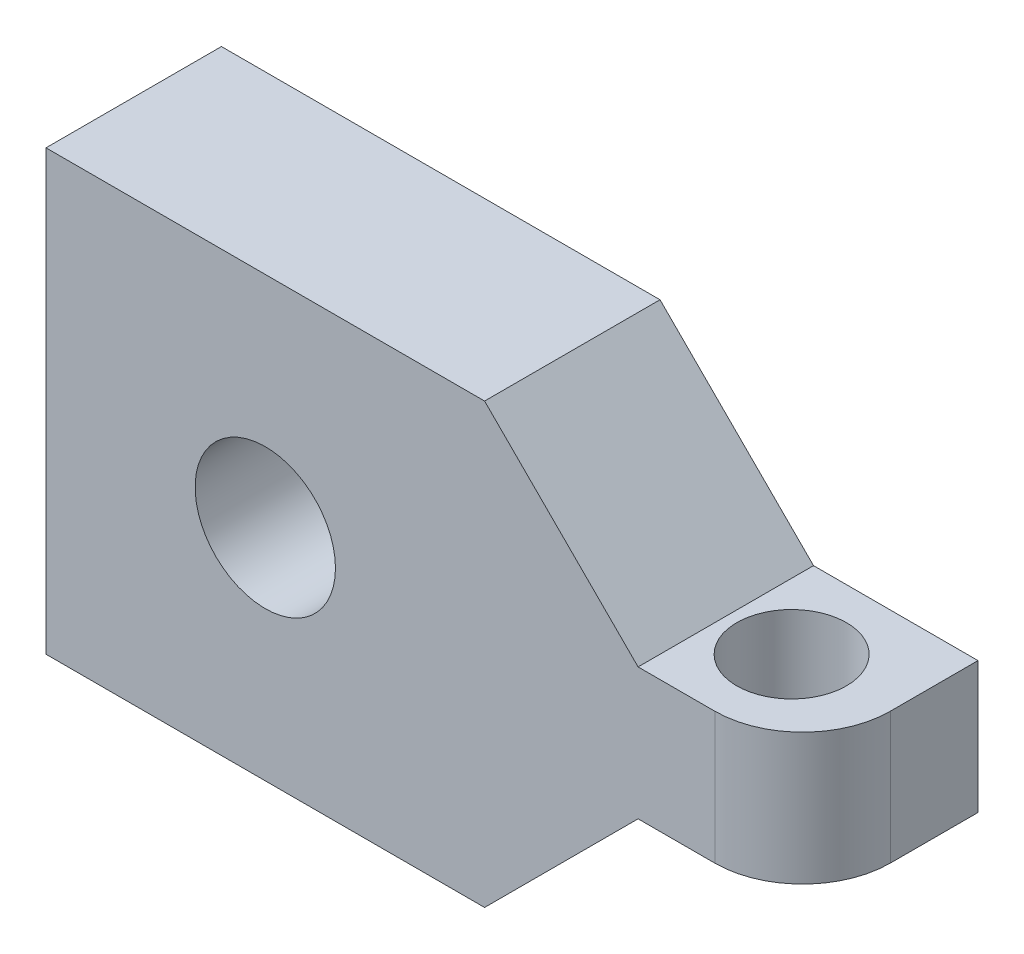
ISO-10303-21;
HEADER;
FILE_DESCRIPTION(('STEP AP214'),'2;1');
FILE_NAME('part.step','',(''),(''),'','','');
FILE_SCHEMA(('AUTOMOTIVE_DESIGN { 1 0 10303 214 1 1 1 1 }'));
ENDSEC;
DATA;
#1=APPLICATION_CONTEXT('core data for automotive mechanical design processes');
#2=APPLICATION_PROTOCOL_DEFINITION('international standard','automotive_design',2000,#1);
#3=PRODUCT_CONTEXT('',#1,'mechanical');
#4=PRODUCT('Part','Part','',(#3));
#5=PRODUCT_RELATED_PRODUCT_CATEGORY('part','',(#4));
#6=PRODUCT_DEFINITION_FORMATION('','',#4);
#7=PRODUCT_DEFINITION_CONTEXT('part definition',#1,'design');
#8=PRODUCT_DEFINITION('design','',#6,#7);
#9=PRODUCT_DEFINITION_SHAPE('','',#8);
#10=(LENGTH_UNIT() NAMED_UNIT(*) SI_UNIT(.MILLI.,.METRE.));
#11=(NAMED_UNIT(*) PLANE_ANGLE_UNIT() SI_UNIT($,.RADIAN.));
#12=(NAMED_UNIT(*) SI_UNIT($,.STERADIAN.) SOLID_ANGLE_UNIT());
#13=UNCERTAINTY_MEASURE_WITH_UNIT(LENGTH_MEASURE(1.E-05),#10,'distance_accuracy_value','');
#14=(GEOMETRIC_REPRESENTATION_CONTEXT(3) GLOBAL_UNCERTAINTY_ASSIGNED_CONTEXT((#13)) GLOBAL_UNIT_ASSIGNED_CONTEXT((#10,
#11,#12)) REPRESENTATION_CONTEXT('',''));
#15=CARTESIAN_POINT('',(0.,0.,0.));
#16=DIRECTION('',(0.,0.,1.));
#17=DIRECTION('',(1.,0.,0.));
#18=AXIS2_PLACEMENT_3D('',#15,#16,#17);
#19=CARTESIAN_POINT('',(-10.,5.,4.));
#20=DIRECTION('',(0.,-1.,0.));
#21=DIRECTION('',(1.,0.,0.));
#22=AXIS2_PLACEMENT_3D('',#19,#20,#21);
#23=PLANE('',#22);
#24=DIRECTION('',(0.,0.,1.));
#25=VECTOR('',#24,1.);
#26=CARTESIAN_POINT('',(0.,5.,0.));
#27=LINE('',#26,#25);
#28=CARTESIAN_POINT('',(0.,5.,0.));
#29=VERTEX_POINT('',#28);
#30=CARTESIAN_POINT('',(0.,5.,4.));
#31=VERTEX_POINT('',#30);
#32=EDGE_CURVE('E139',#29,#31,#27,.T.);
#33=ORIENTED_EDGE('',*,*,#32,.F.);
#34=DIRECTION('',(-1.,0.,0.));
#35=VECTOR('',#34,1.);
#36=CARTESIAN_POINT('',(-10.,5.,0.));
#37=LINE('',#36,#35);
#38=CARTESIAN_POINT('',(-10.,5.,0.));
#39=VERTEX_POINT('',#38);
#40=EDGE_CURVE('E156',#29,#39,#37,.T.);
#41=ORIENTED_EDGE('',*,*,#40,.T.);
#42=DIRECTION('',(0.,0.,-1.));
#43=VECTOR('',#42,1.);
#44=CARTESIAN_POINT('',(-10.,5.,4.));
#45=LINE('',#44,#43);
#46=CARTESIAN_POINT('',(-10.,5.,4.));
#47=VERTEX_POINT('',#46);
#48=EDGE_CURVE('E173',#47,#39,#45,.T.);
#49=ORIENTED_EDGE('',*,*,#48,.F.);
#50=DIRECTION('',(-1.,0.,0.));
#51=VECTOR('',#50,1.);
#52=CARTESIAN_POINT('',(-10.,5.,4.));
#53=LINE('',#52,#51);
#54=EDGE_CURVE('E158',#31,#47,#53,.T.);
#55=ORIENTED_EDGE('',*,*,#54,.F.);
#56=EDGE_LOOP('',(#33,#41,#49,#55));
#57=FACE_BOUND('',#56,.T.);
#58=ADVANCED_FACE('F44',(#57),#23,.F.);
#59=CARTESIAN_POINT('',(7.25,-5.,0.));
#60=DIRECTION('',(-1.,0.,0.));
#61=DIRECTION('',(0.,0.,1.));
#62=AXIS2_PLACEMENT_3D('',#59,#60,#61);
#63=PLANE('',#62);
#64=DIRECTION('',(0.,0.,1.));
#65=VECTOR('',#64,1.);
#66=CARTESIAN_POINT('',(7.25,1.5,0.));
#67=LINE('',#66,#65);
#68=CARTESIAN_POINT('',(7.25,1.5,0.));
#69=VERTEX_POINT('',#68);
#70=CARTESIAN_POINT('',(7.25,1.5,2.));
#71=VERTEX_POINT('',#70);
#72=EDGE_CURVE('E130',#69,#71,#67,.T.);
#73=ORIENTED_EDGE('',*,*,#72,.T.);
#74=DIRECTION('',(0.,-1.,0.));
#75=VECTOR('',#74,1.);
#76=CARTESIAN_POINT('',(7.25,-1.5,2.));
#77=LINE('',#76,#75);
#78=CARTESIAN_POINT('',(7.25,-1.5,2.));
#79=VERTEX_POINT('',#78);
#80=EDGE_CURVE('E192',#71,#79,#77,.T.);
#81=ORIENTED_EDGE('',*,*,#80,.T.);
#82=DIRECTION('',(0.,0.,1.));
#83=VECTOR('',#82,1.);
#84=CARTESIAN_POINT('',(7.25,-1.5,0.));
#85=LINE('',#84,#83);
#86=CARTESIAN_POINT('',(7.25,-1.5,0.));
#87=VERTEX_POINT('',#86);
#88=EDGE_CURVE('E143',#87,#79,#85,.T.);
#89=ORIENTED_EDGE('',*,*,#88,.F.);
#90=DIRECTION('',(0.,-1.,0.));
#91=VECTOR('',#90,1.);
#92=CARTESIAN_POINT('',(7.25,-5.,0.));
#93=LINE('',#92,#91);
#94=EDGE_CURVE('E122',#69,#87,#93,.T.);
#95=ORIENTED_EDGE('',*,*,#94,.F.);
#96=EDGE_LOOP('',(#73,#81,#89,#95));
#97=FACE_BOUND('',#96,.T.);
#98=ADVANCED_FACE('F138',(#97),#63,.F.);
#99=CARTESIAN_POINT('',(-10.,-5.,4.));
#100=DIRECTION('',(1.,0.,0.));
#101=DIRECTION('',(0.,0.,-1.));
#102=AXIS2_PLACEMENT_3D('',#99,#100,#101);
#103=PLANE('',#102);
#104=DIRECTION('',(0.,-1.,0.));
#105=VECTOR('',#104,1.);
#106=CARTESIAN_POINT('',(-10.,-5.,0.));
#107=LINE('',#106,#105);
#108=CARTESIAN_POINT('',(-10.,-5.,0.));
#109=VERTEX_POINT('',#108);
#110=EDGE_CURVE('E169',#39,#109,#107,.T.);
#111=ORIENTED_EDGE('',*,*,#110,.T.);
#112=DIRECTION('',(0.,0.,-1.));
#113=VECTOR('',#112,1.);
#114=CARTESIAN_POINT('',(-10.,-5.,4.));
#115=LINE('',#114,#113);
#116=CARTESIAN_POINT('',(-10.,-5.,4.));
#117=VERTEX_POINT('',#116);
#118=EDGE_CURVE('E167',#117,#109,#115,.T.);
#119=ORIENTED_EDGE('',*,*,#118,.F.);
#120=DIRECTION('',(0.,-1.,0.));
#121=VECTOR('',#120,1.);
#122=CARTESIAN_POINT('',(-10.,-5.,4.));
#123=LINE('',#122,#121);
#124=EDGE_CURVE('E159',#47,#117,#123,.T.);
#125=ORIENTED_EDGE('',*,*,#124,.F.);
#126=ORIENTED_EDGE('',*,*,#48,.T.);
#127=EDGE_LOOP('',(#111,#119,#125,#126));
#128=FACE_BOUND('',#127,.T.);
#129=ADVANCED_FACE('F217',(#128),#103,.F.);
#130=CARTESIAN_POINT('',(-10.,-5.,4.));
#131=DIRECTION('',(0.,1.,0.));
#132=DIRECTION('',(-1.,0.,0.));
#133=AXIS2_PLACEMENT_3D('',#130,#131,#132);
#134=PLANE('',#133);
#135=DIRECTION('',(1.,0.,0.));
#136=VECTOR('',#135,1.);
#137=CARTESIAN_POINT('',(-10.,-5.,0.));
#138=LINE('',#137,#136);
#139=CARTESIAN_POINT('',(0.,-5.,0.));
#140=VERTEX_POINT('',#139);
#141=EDGE_CURVE('E161',#109,#140,#138,.T.);
#142=ORIENTED_EDGE('',*,*,#141,.T.);
#143=DIRECTION('',(0.,0.,1.));
#144=VECTOR('',#143,1.);
#145=CARTESIAN_POINT('',(0.,-5.,0.));
#146=LINE('',#145,#144);
#147=CARTESIAN_POINT('',(0.,-5.,4.));
#148=VERTEX_POINT('',#147);
#149=EDGE_CURVE('E198',#140,#148,#146,.T.);
#150=ORIENTED_EDGE('',*,*,#149,.T.);
#151=DIRECTION('',(1.,0.,0.));
#152=VECTOR('',#151,1.);
#153=CARTESIAN_POINT('',(-10.,-5.,4.));
#154=LINE('',#153,#152);
#155=EDGE_CURVE('E162',#117,#148,#154,.T.);
#156=ORIENTED_EDGE('',*,*,#155,.F.);
#157=ORIENTED_EDGE('',*,*,#118,.T.);
#158=EDGE_LOOP('',(#142,#150,#156,#157));
#159=FACE_BOUND('',#158,.T.);
#160=ADVANCED_FACE('F209',(#159),#134,.F.);
#161=CARTESIAN_POINT('',(0.,0.,4.));
#162=DIRECTION('',(0.,0.,1.));
#163=DIRECTION('',(1.,0.,0.));
#164=AXIS2_PLACEMENT_3D('',#161,#162,#163);
#165=PLANE('',#164);
#166=DIRECTION('',(-1.,0.,0.));
#167=VECTOR('',#166,1.);
#168=CARTESIAN_POINT('',(0.,-1.5,4.));
#169=LINE('',#168,#167);
#170=CARTESIAN_POINT('',(5.25,-1.5,4.));
#171=VERTEX_POINT('',#170);
#172=CARTESIAN_POINT('',(3.49999999999999,-1.5,4.));
#173=VERTEX_POINT('',#172);
#174=EDGE_CURVE('E199',#171,#173,#169,.T.);
#175=ORIENTED_EDGE('',*,*,#174,.F.);
#176=DIRECTION('',(0.,-1.,0.));
#177=VECTOR('',#176,1.);
#178=CARTESIAN_POINT('',(5.25,1.5,4.));
#179=LINE('',#178,#177);
#180=CARTESIAN_POINT('',(5.25,1.5,4.));
#181=VERTEX_POINT('',#180);
#182=EDGE_CURVE('E52',#171,#181,#179,.F.);
#183=ORIENTED_EDGE('',*,*,#182,.T.);
#184=DIRECTION('',(1.,0.,0.));
#185=VECTOR('',#184,1.);
#186=CARTESIAN_POINT('',(0.,1.5,4.));
#187=LINE('',#186,#185);
#188=CARTESIAN_POINT('',(3.50000000000002,1.5,4.));
#189=VERTEX_POINT('',#188);
#190=EDGE_CURVE('E126',#189,#181,#187,.T.);
#191=ORIENTED_EDGE('',*,*,#190,.F.);
#192=DIRECTION('',(0.707106781186551,-0.707106781186544,0.));
#193=VECTOR('',#192,1.);
#194=CARTESIAN_POINT('',(3.50000000000002,1.5,4.));
#195=LINE('',#194,#193);
#196=EDGE_CURVE('E181',#189,#31,#195,.F.);
#197=ORIENTED_EDGE('',*,*,#196,.T.);
#198=ORIENTED_EDGE('',*,*,#54,.T.);
#199=ORIENTED_EDGE('',*,*,#124,.T.);
#200=ORIENTED_EDGE('',*,*,#155,.T.);
#201=DIRECTION('',(-0.707106781186544,-0.707106781186551,0.));
#202=VECTOR('',#201,1.);
#203=CARTESIAN_POINT('',(0.,-5.00000000000002,4.));
#204=LINE('',#203,#202);
#205=EDGE_CURVE('E186',#148,#173,#204,.F.);
#206=ORIENTED_EDGE('',*,*,#205,.T.);
#207=EDGE_LOOP('',(#175,#183,#191,#197,#198,#199,#200,#206));
#208=FACE_BOUND('',#207,.T.);
#209=CARTESIAN_POINT('',(-5.,0.,4.));
#210=DIRECTION('',(0.,0.,1.));
#211=DIRECTION('',(1.,0.,0.));
#212=AXIS2_PLACEMENT_3D('',#209,#210,#211);
#213=CIRCLE('',#212,1.6);
#214=CARTESIAN_POINT('',(-3.4,0.,4.));
#215=VERTEX_POINT('',#214);
#216=EDGE_CURVE('E142',#215,#215,#213,.T.);
#217=ORIENTED_EDGE('',*,*,#216,.F.);
#218=EDGE_LOOP('',(#217));
#219=FACE_BOUND('',#218,.T.);
#220=ADVANCED_FACE('F211',(#208,#219),#165,.T.);
#221=CARTESIAN_POINT('',(0.,0.,0.));
#222=DIRECTION('',(0.,0.,1.));
#223=DIRECTION('',(1.,0.,0.));
#224=AXIS2_PLACEMENT_3D('',#221,#222,#223);
#225=PLANE('',#224);
#226=CARTESIAN_POINT('',(-5.,0.,0.));
#227=DIRECTION('',(0.,0.,1.));
#228=DIRECTION('',(1.,0.,0.));
#229=AXIS2_PLACEMENT_3D('',#226,#227,#228);
#230=CIRCLE('',#229,1.6);
#231=CARTESIAN_POINT('',(-3.4,0.,0.));
#232=VERTEX_POINT('',#231);
#233=EDGE_CURVE('E148',#232,#232,#230,.T.);
#234=ORIENTED_EDGE('',*,*,#233,.T.);
#235=EDGE_LOOP('',(#234));
#236=FACE_BOUND('',#235,.T.);
#237=ORIENTED_EDGE('',*,*,#40,.F.);
#238=DIRECTION('',(-0.707106781186551,0.707106781186544,0.));
#239=VECTOR('',#238,1.);
#240=CARTESIAN_POINT('',(2.49999999999999,2.50000000000002,0.));
#241=LINE('',#240,#239);
#242=CARTESIAN_POINT('',(3.50000000000002,1.5,0.));
#243=VERTEX_POINT('',#242);
#244=EDGE_CURVE('E125',#29,#243,#241,.F.);
#245=ORIENTED_EDGE('',*,*,#244,.T.);
#246=DIRECTION('',(1.,0.,0.));
#247=VECTOR('',#246,1.);
#248=CARTESIAN_POINT('',(0.,1.5,0.));
#249=LINE('',#248,#247);
#250=EDGE_CURVE('E113',#243,#69,#249,.T.);
#251=ORIENTED_EDGE('',*,*,#250,.T.);
#252=ORIENTED_EDGE('',*,*,#94,.T.);
#253=DIRECTION('',(-1.,0.,0.));
#254=VECTOR('',#253,1.);
#255=CARTESIAN_POINT('',(0.,-1.5,0.));
#256=LINE('',#255,#254);
#257=CARTESIAN_POINT('',(3.49999999999999,-1.5,0.));
#258=VERTEX_POINT('',#257);
#259=EDGE_CURVE('E153',#87,#258,#256,.T.);
#260=ORIENTED_EDGE('',*,*,#259,.T.);
#261=DIRECTION('',(0.707106781186544,0.707106781186551,0.));
#262=VECTOR('',#261,1.);
#263=CARTESIAN_POINT('',(2.50000000000001,-2.49999999999999,0.));
#264=LINE('',#263,#262);
#265=EDGE_CURVE('E188',#258,#140,#264,.F.);
#266=ORIENTED_EDGE('',*,*,#265,.T.);
#267=ORIENTED_EDGE('',*,*,#141,.F.);
#268=ORIENTED_EDGE('',*,*,#110,.F.);
#269=EDGE_LOOP('',(#237,#245,#251,#252,#260,#266,#267,#268));
#270=FACE_BOUND('',#269,.T.);
#271=ADVANCED_FACE('F119',(#236,#270),#225,.F.);
#272=CARTESIAN_POINT('',(-5.,0.,0.));
#273=DIRECTION('',(0.,0.,1.));
#274=DIRECTION('',(1.,0.,0.));
#275=AXIS2_PLACEMENT_3D('',#272,#273,#274);
#276=CYLINDRICAL_SURFACE('',#275,1.6);
#277=ORIENTED_EDGE('',*,*,#233,.F.);
#278=EDGE_LOOP('',(#277));
#279=FACE_BOUND('',#278,.T.);
#280=ORIENTED_EDGE('',*,*,#216,.T.);
#281=EDGE_LOOP('',(#280));
#282=FACE_BOUND('',#281,.T.);
#283=ADVANCED_FACE('F261',(#279,#282),#276,.F.);
#284=CARTESIAN_POINT('',(0.,-1.5,0.));
#285=DIRECTION('',(0.,1.,0.));
#286=DIRECTION('',(0.,0.,1.));
#287=AXIS2_PLACEMENT_3D('',#284,#285,#286);
#288=PLANE('',#287);
#289=ORIENTED_EDGE('',*,*,#88,.T.);
#290=CARTESIAN_POINT('',(5.25,-1.5,2.));
#291=DIRECTION('',(0.,1.,0.));
#292=DIRECTION('',(0.,0.,1.));
#293=AXIS2_PLACEMENT_3D('',#290,#291,#292);
#294=CIRCLE('',#293,2.);
#295=EDGE_CURVE('E69',#79,#171,#294,.F.);
#296=ORIENTED_EDGE('',*,*,#295,.T.);
#297=ORIENTED_EDGE('',*,*,#174,.T.);
#298=DIRECTION('',(0.,0.,-1.));
#299=VECTOR('',#298,1.);
#300=CARTESIAN_POINT('',(3.49999999999999,-1.5,0.));
#301=LINE('',#300,#299);
#302=EDGE_CURVE('E182',#173,#258,#301,.T.);
#303=ORIENTED_EDGE('',*,*,#302,.T.);
#304=ORIENTED_EDGE('',*,*,#259,.F.);
#305=EDGE_LOOP('',(#289,#296,#297,#303,#304));
#306=FACE_BOUND('',#305,.T.);
#307=CARTESIAN_POINT('',(5.,-1.5,2.));
#308=DIRECTION('',(0.,1.,0.));
#309=DIRECTION('',(0.,0.,1.));
#310=AXIS2_PLACEMENT_3D('',#307,#308,#309);
#311=CIRCLE('',#310,1.25);
#312=CARTESIAN_POINT('',(6.25,-1.5,2.));
#313=VERTEX_POINT('',#312);
#314=EDGE_CURVE('E149',#313,#313,#311,.F.);
#315=ORIENTED_EDGE('',*,*,#314,.F.);
#316=EDGE_LOOP('',(#315));
#317=FACE_BOUND('',#316,.T.);
#318=ADVANCED_FACE('F191',(#306,#317),#288,.F.);
#319=CARTESIAN_POINT('',(0.,1.5,0.));
#320=DIRECTION('',(0.,-1.,0.));
#321=DIRECTION('',(0.,0.,-1.));
#322=AXIS2_PLACEMENT_3D('',#319,#320,#321);
#323=PLANE('',#322);
#324=ORIENTED_EDGE('',*,*,#190,.T.);
#325=CARTESIAN_POINT('',(5.25,1.5,2.));
#326=DIRECTION('',(0.,-1.,0.));
#327=DIRECTION('',(0.,0.,-1.));
#328=AXIS2_PLACEMENT_3D('',#325,#326,#327);
#329=CIRCLE('',#328,2.);
#330=EDGE_CURVE('E11',#181,#71,#329,.F.);
#331=ORIENTED_EDGE('',*,*,#330,.T.);
#332=ORIENTED_EDGE('',*,*,#72,.F.);
#333=ORIENTED_EDGE('',*,*,#250,.F.);
#334=DIRECTION('',(0.,0.,1.));
#335=VECTOR('',#334,1.);
#336=CARTESIAN_POINT('',(3.50000000000002,1.5,4.));
#337=LINE('',#336,#335);
#338=EDGE_CURVE('E179',#243,#189,#337,.T.);
#339=ORIENTED_EDGE('',*,*,#338,.T.);
#340=EDGE_LOOP('',(#324,#331,#332,#333,#339));
#341=FACE_BOUND('',#340,.T.);
#342=CARTESIAN_POINT('',(5.,1.5,2.));
#343=DIRECTION('',(0.,-1.,0.));
#344=DIRECTION('',(0.,0.,-1.));
#345=AXIS2_PLACEMENT_3D('',#342,#343,#344);
#346=CIRCLE('',#345,1.25);
#347=CARTESIAN_POINT('',(6.25,1.5,2.));
#348=VERTEX_POINT('',#347);
#349=EDGE_CURVE('E141',#348,#348,#346,.F.);
#350=ORIENTED_EDGE('',*,*,#349,.F.);
#351=EDGE_LOOP('',(#350));
#352=FACE_BOUND('',#351,.T.);
#353=ADVANCED_FACE('F131',(#341,#352),#323,.F.);
#354=CARTESIAN_POINT('',(5.,5.,2.));
#355=DIRECTION('',(0.,-1.,0.));
#356=DIRECTION('',(1.,0.,0.));
#357=AXIS2_PLACEMENT_3D('',#354,#355,#356);
#358=CYLINDRICAL_SURFACE('',#357,1.25);
#359=CARTESIAN_POINT('',(6.25,1.5,2.));
#360=CARTESIAN_POINT('',(6.25,1.46875,2.));
#361=CARTESIAN_POINT('',(6.25,1.4375,2.));
#362=CARTESIAN_POINT('',(6.25,1.375,2.));
#363=CARTESIAN_POINT('',(6.25,1.34375,2.));
#364=CARTESIAN_POINT('',(6.25,1.28125,2.));
#365=CARTESIAN_POINT('',(6.25,1.25,2.));
#366=CARTESIAN_POINT('',(6.25,1.1875,2.));
#367=CARTESIAN_POINT('',(6.25,1.15625,2.));
#368=CARTESIAN_POINT('',(6.25,1.09375,2.));
#369=CARTESIAN_POINT('',(6.25,1.0625,2.));
#370=CARTESIAN_POINT('',(6.25,0.999999999999999,2.));
#371=CARTESIAN_POINT('',(6.25,0.968749999999999,2.));
#372=CARTESIAN_POINT('',(6.25,0.906249999999999,2.));
#373=CARTESIAN_POINT('',(6.25,0.874999999999999,2.));
#374=CARTESIAN_POINT('',(6.25,0.812499999999999,2.));
#375=CARTESIAN_POINT('',(6.25,0.781249999999999,2.));
#376=CARTESIAN_POINT('',(6.25,0.718749999999999,2.));
#377=CARTESIAN_POINT('',(6.25,0.687499999999999,2.));
#378=CARTESIAN_POINT('',(6.25,0.624999999999999,2.));
#379=CARTESIAN_POINT('',(6.25,0.593749999999999,2.));
#380=CARTESIAN_POINT('',(6.25,0.531249999999999,2.));
#381=CARTESIAN_POINT('',(6.25,0.499999999999999,2.));
#382=CARTESIAN_POINT('',(6.25,0.437499999999999,2.));
#383=CARTESIAN_POINT('',(6.25,0.406249999999999,2.));
#384=CARTESIAN_POINT('',(6.25,0.343749999999999,2.));
#385=CARTESIAN_POINT('',(6.25,0.312499999999999,2.));
#386=CARTESIAN_POINT('',(6.25,0.249999999999999,2.));
#387=CARTESIAN_POINT('',(6.25,0.218749999999999,2.));
#388=CARTESIAN_POINT('',(6.25,0.156249999999999,2.));
#389=CARTESIAN_POINT('',(6.25,0.124999999999999,2.));
#390=CARTESIAN_POINT('',(6.25,0.0624999999999992,2.));
#391=CARTESIAN_POINT('',(6.25,0.0312499999999992,2.));
#392=CARTESIAN_POINT('',(6.25,-0.0312500000000009,2.));
#393=CARTESIAN_POINT('',(6.25,-0.0625000000000009,2.));
#394=CARTESIAN_POINT('',(6.25,-0.125000000000001,2.));
#395=CARTESIAN_POINT('',(6.25,-0.156250000000001,2.));
#396=CARTESIAN_POINT('',(6.25,-0.218750000000001,2.));
#397=CARTESIAN_POINT('',(6.25,-0.250000000000001,2.));
#398=CARTESIAN_POINT('',(6.25,-0.312500000000001,2.));
#399=CARTESIAN_POINT('',(6.25,-0.343750000000001,2.));
#400=CARTESIAN_POINT('',(6.25,-0.406250000000001,2.));
#401=CARTESIAN_POINT('',(6.25,-0.437500000000001,2.));
#402=CARTESIAN_POINT('',(6.25,-0.500000000000001,2.));
#403=CARTESIAN_POINT('',(6.25,-0.531250000000001,2.));
#404=CARTESIAN_POINT('',(6.25,-0.593750000000001,2.));
#405=CARTESIAN_POINT('',(6.25,-0.625000000000001,2.));
#406=CARTESIAN_POINT('',(6.25,-0.687500000000001,2.));
#407=CARTESIAN_POINT('',(6.25,-0.718750000000002,2.));
#408=CARTESIAN_POINT('',(6.25,-0.781250000000002,2.));
#409=CARTESIAN_POINT('',(6.25,-0.812500000000002,2.));
#410=CARTESIAN_POINT('',(6.25,-0.875000000000002,2.));
#411=CARTESIAN_POINT('',(6.25,-0.906250000000002,2.));
#412=CARTESIAN_POINT('',(6.25,-0.968750000000002,2.));
#413=CARTESIAN_POINT('',(6.25,-1.,2.));
#414=CARTESIAN_POINT('',(6.25,-1.0625,2.));
#415=CARTESIAN_POINT('',(6.25,-1.09375,2.));
#416=CARTESIAN_POINT('',(6.25,-1.15625,2.));
#417=CARTESIAN_POINT('',(6.25,-1.1875,2.));
#418=CARTESIAN_POINT('',(6.25,-1.25,2.));
#419=CARTESIAN_POINT('',(6.25,-1.28125,2.));
#420=CARTESIAN_POINT('',(6.25,-1.34375,2.));
#421=CARTESIAN_POINT('',(6.25,-1.375,2.));
#422=CARTESIAN_POINT('',(6.25,-1.4375,2.));
#423=CARTESIAN_POINT('',(6.25,-1.46875,2.));
#424=CARTESIAN_POINT('',(6.25,-1.5,2.));
#425=B_SPLINE_CURVE_WITH_KNOTS('',3,(#359,#360,#361,#362,#363,#364,#365,#366,#367,#368,#369,
#370,#371,#372,#373,#374,#375,#376,#377,#378,#379,#380,#381,#382,#383,#384,#385,#386,#387,#388,
#389,#390,#391,#392,#393,#394,#395,#396,#397,#398,#399,#400,#401,#402,#403,#404,#405,#406,#407,
#408,#409,#410,#411,#412,#413,#414,#415,#416,#417,#418,#419,#420,#421,#422,#423,#424),
.UNSPECIFIED.,.F.,.F.,(4,2,2,2,2,2,2,2,2,2,2,2,2,2,2,2,2,2,2,2,2,2,2,2,2,2,2,2,2,2,2,2,4),(0.,
0.0937500000000001,0.1875,0.28125,0.375,0.46875,0.5625,0.65625,0.75,0.84375,0.9375,1.03125,
1.125,1.21875,1.3125,1.40625,1.5,1.59375,1.6875,1.78125,1.875,1.96875,2.0625,2.15625,2.25,
2.34375,2.4375,2.53125,2.625,2.71875,2.8125,2.90625,3.),.UNSPECIFIED.);
#426=EDGE_CURVE('BSEAM247',#348,#313,#425,.T.);
#427=ORIENTED_EDGE('',*,*,#349,.T.);
#428=ORIENTED_EDGE('',*,*,#314,.T.);
#429=ORIENTED_EDGE('',*,*,#426,.T.);
#430=ORIENTED_EDGE('',*,*,#426,.F.);
#431=EDGE_LOOP('',(#427,#429,#428,#430));
#432=FACE_BOUND('',#431,.T.);
#433=ADVANCED_FACE('F247',(#432),#358,.F.);
#434=CARTESIAN_POINT('',(3.50000000000002,1.5,0.));
#435=DIRECTION('',(0.707106781186544,0.707106781186551,0.));
#436=DIRECTION('',(0.,0.,-1.));
#437=AXIS2_PLACEMENT_3D('',#434,#435,#436);
#438=PLANE('',#437);
#439=ORIENTED_EDGE('',*,*,#244,.F.);
#440=ORIENTED_EDGE('',*,*,#32,.T.);
#441=ORIENTED_EDGE('',*,*,#196,.F.);
#442=ORIENTED_EDGE('',*,*,#338,.F.);
#443=EDGE_LOOP('',(#439,#440,#441,#442));
#444=FACE_BOUND('',#443,.T.);
#445=ADVANCED_FACE('F221',(#444),#438,.T.);
#446=CARTESIAN_POINT('',(0.,-5.00000000000002,0.));
#447=DIRECTION('',(0.707106781186551,-0.707106781186544,0.));
#448=DIRECTION('',(0.,0.,-1.));
#449=AXIS2_PLACEMENT_3D('',#446,#447,#448);
#450=PLANE('',#449);
#451=ORIENTED_EDGE('',*,*,#265,.F.);
#452=ORIENTED_EDGE('',*,*,#302,.F.);
#453=ORIENTED_EDGE('',*,*,#205,.F.);
#454=ORIENTED_EDGE('',*,*,#149,.F.);
#455=EDGE_LOOP('',(#451,#452,#453,#454));
#456=FACE_BOUND('',#455,.T.);
#457=ADVANCED_FACE('F210',(#456),#450,.T.);
#458=CARTESIAN_POINT('',(5.25,-5.,2.));
#459=DIRECTION('',(0.,1.,0.));
#460=DIRECTION('',(0.,0.,1.));
#461=AXIS2_PLACEMENT_3D('',#458,#459,#460);
#462=CYLINDRICAL_SURFACE('',#461,2.);
#463=ORIENTED_EDGE('',*,*,#330,.F.);
#464=ORIENTED_EDGE('',*,*,#182,.F.);
#465=ORIENTED_EDGE('',*,*,#295,.F.);
#466=ORIENTED_EDGE('',*,*,#80,.F.);
#467=EDGE_LOOP('',(#463,#464,#465,#466));
#468=FACE_BOUND('',#467,.T.);
#469=ADVANCED_FACE('F50',(#468),#462,.T.);
#470=CLOSED_SHELL('',(#58,#98,#129,#160,#220,#271,#283,#318,#353,#433,#445,#457,#469));
#471=MANIFOLD_SOLID_BREP('B2',#470);
#472=ADVANCED_BREP_SHAPE_REPRESENTATION('',(#18,#471),#14);
#473=SHAPE_DEFINITION_REPRESENTATION(#9,#472);
ENDSEC;
END-ISO-10303-21;
